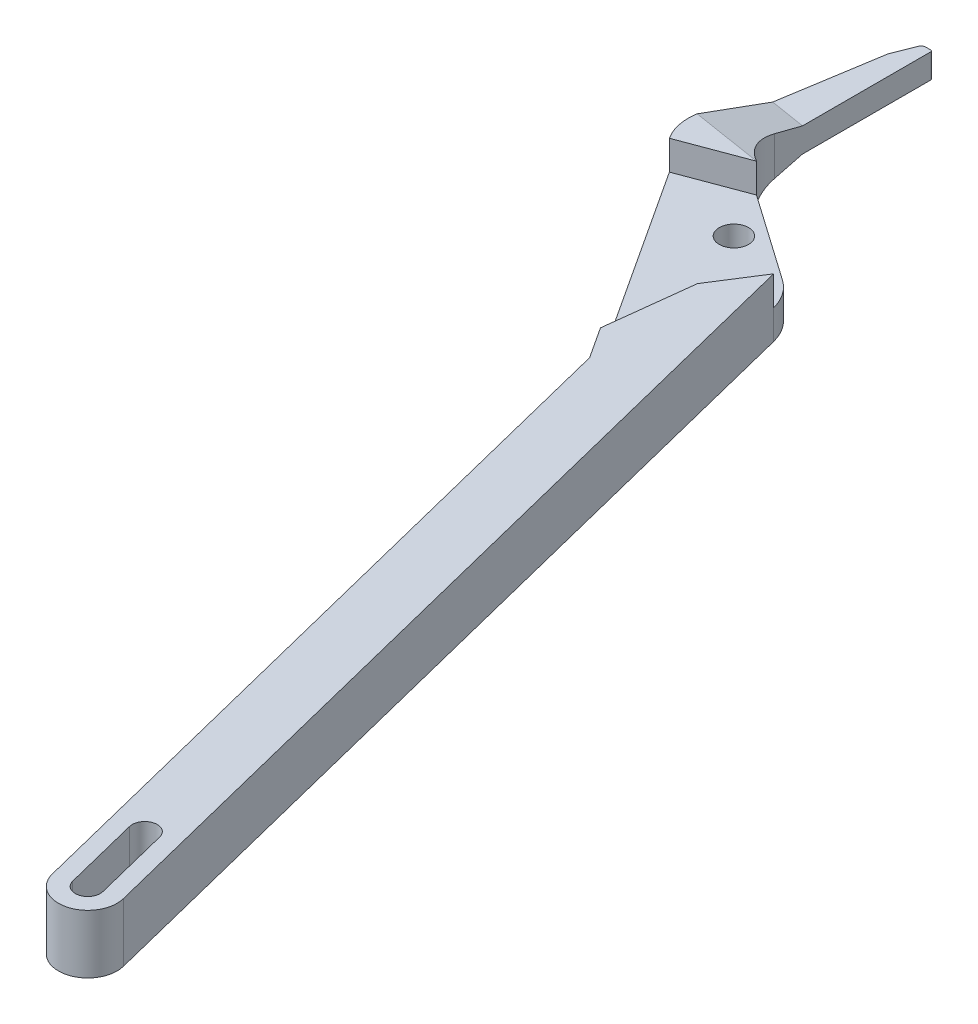
ISO-10303-21;
HEADER;
FILE_DESCRIPTION(('STEP AP214'),'2;1');
FILE_NAME('part.step','',(''),(''),'','','');
FILE_SCHEMA(('AUTOMOTIVE_DESIGN { 1 0 10303 214 1 1 1 1 }'));
ENDSEC;
DATA;
#1=APPLICATION_CONTEXT('core data for automotive mechanical design processes');
#2=APPLICATION_PROTOCOL_DEFINITION('international standard','automotive_design',2000,#1);
#3=PRODUCT_CONTEXT('',#1,'mechanical');
#4=PRODUCT('Part','Part','',(#3));
#5=PRODUCT_RELATED_PRODUCT_CATEGORY('part','',(#4));
#6=PRODUCT_DEFINITION_FORMATION('','',#4);
#7=PRODUCT_DEFINITION_CONTEXT('part definition',#1,'design');
#8=PRODUCT_DEFINITION('design','',#6,#7);
#9=PRODUCT_DEFINITION_SHAPE('','',#8);
#10=(LENGTH_UNIT() NAMED_UNIT(*) SI_UNIT(.MILLI.,.METRE.));
#11=(NAMED_UNIT(*) PLANE_ANGLE_UNIT() SI_UNIT($,.RADIAN.));
#12=(NAMED_UNIT(*) SI_UNIT($,.STERADIAN.) SOLID_ANGLE_UNIT());
#13=UNCERTAINTY_MEASURE_WITH_UNIT(LENGTH_MEASURE(1.E-05),#10,'distance_accuracy_value','');
#14=(GEOMETRIC_REPRESENTATION_CONTEXT(3) GLOBAL_UNCERTAINTY_ASSIGNED_CONTEXT((#13)) GLOBAL_UNIT_ASSIGNED_CONTEXT((#10,
#11,#12)) REPRESENTATION_CONTEXT('',''));
#15=CARTESIAN_POINT('',(0.,0.,0.));
#16=DIRECTION('',(0.,0.,1.));
#17=DIRECTION('',(1.,0.,0.));
#18=AXIS2_PLACEMENT_3D('',#15,#16,#17);
#19=CARTESIAN_POINT('',(0.,12.,0.));
#20=DIRECTION('',(0.,1.,0.));
#21=DIRECTION('',(0.,0.,1.));
#22=AXIS2_PLACEMENT_3D('',#19,#20,#21);
#23=PLANE('',#22);
#24=CARTESIAN_POINT('',(55.1439401965051,12.,187.354629282802));
#25=DIRECTION('',(0.,1.,0.));
#26=DIRECTION('',(0.,0.,1.));
#27=AXIS2_PLACEMENT_3D('',#24,#25,#26);
#28=CIRCLE('',#27,2.54999999999998);
#29=CARTESIAN_POINT('',(52.669686094504,12.,187.971530116592));
#30=VERTEX_POINT('',#29);
#31=CARTESIAN_POINT('',(57.6181942985063,12.,186.737728449012));
#32=VERTEX_POINT('',#31);
#33=EDGE_CURVE('E372',#30,#32,#28,.T.);
#34=ORIENTED_EDGE('',*,*,#33,.F.);
#35=DIRECTION('',(-0.241921895603772,0.,-0.970295726274974));
#36=VECTOR('',#35,1.);
#37=CARTESIAN_POINT('',(5.46348532178834,12.,-1.36219988386906));
#38=LINE('',#37,#36);
#39=CARTESIAN_POINT('',(48.7989357649167,12.,172.446798496485));
#40=VERTEX_POINT('',#39);
#41=EDGE_CURVE('E376',#30,#40,#38,.T.);
#42=ORIENTED_EDGE('',*,*,#41,.T.);
#43=CARTESIAN_POINT('',(51.2731898669178,12.,171.829897662696));
#44=DIRECTION('',(0.,1.,0.));
#45=DIRECTION('',(0.,0.,1.));
#46=AXIS2_PLACEMENT_3D('',#43,#44,#45);
#47=CIRCLE('',#46,2.54999999999997);
#48=CARTESIAN_POINT('',(53.747443968919,12.,171.212996828906));
#49=VERTEX_POINT('',#48);
#50=EDGE_CURVE('E379',#49,#40,#47,.T.);
#51=ORIENTED_EDGE('',*,*,#50,.F.);
#52=DIRECTION('',(-0.241921895603773,0.,-0.970295726274974));
#53=VECTOR('',#52,1.);
#54=CARTESIAN_POINT('',(10.4119935257905,12.,-2.59600155144826));
#55=LINE('',#54,#53);
#56=EDGE_CURVE('E383',#32,#49,#55,.T.);
#57=ORIENTED_EDGE('',*,*,#56,.F.);
#58=EDGE_LOOP('',(#34,#42,#51,#57));
#59=FACE_BOUND('',#58,.T.);
#60=DIRECTION('',(0.241921895603773,0.,0.970295726274974));
#61=VECTOR('',#60,1.);
#62=CARTESIAN_POINT('',(13.759513781435,12.,-3.43063209128024));
#63=LINE('',#62,#61);
#64=CARTESIAN_POINT('',(16.7667624796419,12.,8.63078364967044));
#65=VERTEX_POINT('',#64);
#66=CARTESIAN_POINT('',(60.9657145541507,12.,185.903097909181));
#67=VERTEX_POINT('',#66);
#68=EDGE_CURVE('E359',#65,#67,#63,.T.);
#69=ORIENTED_EDGE('',*,*,#68,.F.);
#70=DIRECTION('',(-0.536479988899588,0.,0.84391304143869));
#71=VECTOR('',#70,1.);
#72=CARTESIAN_POINT('',(15.848629731164,12.,10.0750578374209));
#73=LINE('',#72,#71);
#74=CARTESIAN_POINT('',(10.7122054412359,12.,18.1549406556487));
#75=VERTEX_POINT('',#74);
#76=EDGE_CURVE('E569',#65,#75,#73,.T.);
#77=ORIENTED_EDGE('',*,*,#76,.T.);
#78=DIRECTION('',(0.116867877169824,0.,-0.993147471066518));
#79=VECTOR('',#78,1.);
#80=CARTESIAN_POINT('',(12.67308722309,12.,1.49129594959353));
#81=LINE('',#80,#79);
#82=CARTESIAN_POINT('',(8.62075702087554,12.,35.9281454048767));
#83=VERTEX_POINT('',#82);
#84=EDGE_CURVE('E577',#83,#75,#81,.T.);
#85=ORIENTED_EDGE('',*,*,#84,.F.);
#86=DIRECTION('',(0.546821382181398,0.,0.837249291423544));
#87=VECTOR('',#86,1.);
#88=CARTESIAN_POINT('',(-10.405799220694,12.,6.79619985451084));
#89=LINE('',#88,#87);
#90=CARTESIAN_POINT('',(12.8013367550747,12.,42.3291156928981));
#91=VERTEX_POINT('',#90);
#92=EDGE_CURVE('E256',#83,#91,#89,.T.);
#93=ORIENTED_EDGE('',*,*,#92,.T.);
#94=DIRECTION('',(-0.241921895603773,0.,-0.970295726274974));
#95=VECTOR('',#94,1.);
#96=CARTESIAN_POINT('',(2.11596506614388,12.,-0.527569344037099));
#97=LINE('',#96,#95);
#98=CARTESIAN_POINT('',(49.3221658388595,12.,188.806160656424));
#99=VERTEX_POINT('',#98);
#100=EDGE_CURVE('E351',#99,#91,#97,.T.);
#101=ORIENTED_EDGE('',*,*,#100,.F.);
#102=CARTESIAN_POINT('',(55.1439401965051,12.,187.354629282802));
#103=DIRECTION('',(0.,1.,0.));
#104=DIRECTION('',(0.,0.,1.));
#105=AXIS2_PLACEMENT_3D('',#102,#103,#104);
#106=CIRCLE('',#105,5.99999999923498);
#107=EDGE_CURVE('E355',#99,#67,#106,.T.);
#108=ORIENTED_EDGE('',*,*,#107,.T.);
#109=EDGE_LOOP('',(#69,#77,#85,#93,#101,#108));
#110=FACE_BOUND('',#109,.T.);
#111=ADVANCED_FACE('F56',(#59,#110),#23,.T.);
#112=CARTESIAN_POINT('',(7.06380521689738,12.,11.0500026057069));
#113=DIRECTION('',(0.,-1.,0.));
#114=DIRECTION('',(0.,0.,-1.));
#115=AXIS2_PLACEMENT_3D('',#112,#113,#114);
#116=CYLINDRICAL_SURFACE('',#115,9.99999999999465);
#117=DIRECTION('',(0.,-1.,0.));
#118=VECTOR('',#117,1.);
#119=CARTESIAN_POINT('',(12.7995695803869,12.,2.85848216280857));
#120=LINE('',#119,#118);
#121=CARTESIAN_POINT('',(12.7995695803868,6.,2.85848216280873));
#122=VERTEX_POINT('',#121);
#123=CARTESIAN_POINT('',(12.7995695803869,0.,2.85848216280857));
#124=VERTEX_POINT('',#123);
#125=EDGE_CURVE('E492',#122,#124,#120,.T.);
#126=ORIENTED_EDGE('',*,*,#125,.F.);
#127=CARTESIAN_POINT('',(7.06380521689738,6.,11.0500026057069));
#128=DIRECTION('',(0.,1.,0.));
#129=DIRECTION('',(0.,0.,1.));
#130=AXIS2_PLACEMENT_3D('',#127,#128,#129);
#131=CIRCLE('',#130,9.99999999999465);
#132=CARTESIAN_POINT('',(16.7667624796419,6.,8.63078364967044));
#133=VERTEX_POINT('',#132);
#134=EDGE_CURVE('E524',#133,#122,#131,.T.);
#135=ORIENTED_EDGE('',*,*,#134,.F.);
#136=DIRECTION('',(0.,-1.,0.));
#137=VECTOR('',#136,1.);
#138=CARTESIAN_POINT('',(16.7667624796417,12.,8.63078364967049));
#139=LINE('',#138,#137);
#140=CARTESIAN_POINT('',(16.7667624796417,0.,8.63078364967049));
#141=VERTEX_POINT('',#140);
#142=EDGE_CURVE('E495',#133,#141,#139,.T.);
#143=ORIENTED_EDGE('',*,*,#142,.T.);
#144=CARTESIAN_POINT('',(7.06380521689738,0.,11.0500026057069));
#145=DIRECTION('',(0.,1.,0.));
#146=DIRECTION('',(0.,0.,1.));
#147=AXIS2_PLACEMENT_3D('',#144,#145,#146);
#148=CIRCLE('',#147,9.99999999999465);
#149=EDGE_CURVE('E399',#124,#141,#148,.F.);
#150=ORIENTED_EDGE('',*,*,#149,.F.);
#151=EDGE_LOOP('',(#126,#135,#143,#150));
#152=FACE_BOUND('',#151,.T.);
#153=ADVANCED_FACE('F523',(#152),#116,.T.);
#154=CARTESIAN_POINT('',(0.,12.,0.));
#155=DIRECTION('',(0.,-1.,0.));
#156=DIRECTION('',(0.,0.,-1.));
#157=AXIS2_PLACEMENT_3D('',#154,#155,#156);
#158=CYLINDRICAL_SURFACE('',#157,3.);
#159=CARTESIAN_POINT('',(0.,0.,0.));
#160=DIRECTION('',(0.,1.,0.));
#161=DIRECTION('',(0.,0.,1.));
#162=AXIS2_PLACEMENT_3D('',#159,#160,#161);
#163=CIRCLE('',#162,3.);
#164=CARTESIAN_POINT('',(0.,0.,3.));
#165=VERTEX_POINT('',#164);
#166=EDGE_CURVE('E356',#165,#165,#163,.T.);
#167=ORIENTED_EDGE('',*,*,#166,.F.);
#168=EDGE_LOOP('',(#167));
#169=FACE_BOUND('',#168,.T.);
#170=CARTESIAN_POINT('',(0.,6.,0.));
#171=DIRECTION('',(0.,1.,0.));
#172=DIRECTION('',(0.,0.,1.));
#173=AXIS2_PLACEMENT_3D('',#170,#171,#172);
#174=CIRCLE('',#173,3.);
#175=CARTESIAN_POINT('',(0.,6.,3.));
#176=VERTEX_POINT('',#175);
#177=EDGE_CURVE('E251',#176,#176,#174,.F.);
#178=ORIENTED_EDGE('',*,*,#177,.F.);
#179=EDGE_LOOP('',(#178));
#180=FACE_BOUND('',#179,.T.);
#181=ADVANCED_FACE('F601',(#169,#180),#158,.F.);
#182=CARTESIAN_POINT('',(2.86788218145437,12.,-4.09576022103421));
#183=DIRECTION('',(0.573576436349266,0.,-0.819152044290238));
#184=DIRECTION('',(-0.819152044290239,0.,-0.573576436349266));
#185=AXIS2_PLACEMENT_3D('',#182,#183,#184);
#186=PLANE('',#185);
#187=DIRECTION('',(0.,1.,0.));
#188=VECTOR('',#187,1.);
#189=CARTESIAN_POINT('',(-4.95077941001486,6.,-9.57044600606636));
#190=LINE('',#189,#188);
#191=CARTESIAN_POINT('',(-4.95077941001486,6.,-9.57044600606636));
#192=VERTEX_POINT('',#191);
#193=CARTESIAN_POINT('',(-4.95077941001486,12.,-9.57044600606636));
#194=VERTEX_POINT('',#193);
#195=EDGE_CURVE('E262',#192,#194,#190,.T.);
#196=ORIENTED_EDGE('',*,*,#195,.F.);
#197=DIRECTION('',(-0.819152044290239,0.,-0.573576436349266));
#198=VECTOR('',#197,1.);
#199=CARTESIAN_POINT('',(2.86788218145437,6.,-4.09576022103421));
#200=LINE('',#199,#198);
#201=EDGE_CURVE('E264',#122,#192,#200,.T.);
#202=ORIENTED_EDGE('',*,*,#201,.F.);
#203=ORIENTED_EDGE('',*,*,#125,.T.);
#204=DIRECTION('',(0.819152044290239,0.,0.573576436349266));
#205=VECTOR('',#204,1.);
#206=CARTESIAN_POINT('',(2.86788218145437,0.,-4.09576022103421));
#207=LINE('',#206,#205);
#208=CARTESIAN_POINT('',(-4.95077941001487,0.,-9.57044600606637));
#209=VERTEX_POINT('',#208);
#210=EDGE_CURVE('E403',#209,#124,#207,.T.);
#211=ORIENTED_EDGE('',*,*,#210,.F.);
#212=DIRECTION('',(0.81395029880329,-0.112516633880118,0.569934134947473));
#213=VECTOR('',#212,1.);
#214=CARTESIAN_POINT('',(1.66990260801636,-0.915211722085175,-4.93459454897287));
#215=LINE('',#214,#213);
#216=CARTESIAN_POINT('',(-5.73576436348951,0.10851260174161,-10.120098387868));
#217=VERTEX_POINT('',#216);
#218=EDGE_CURVE('E293',#217,#209,#215,.T.);
#219=ORIENTED_EDGE('',*,*,#218,.F.);
#220=DIRECTION('',(0.,-1.,0.));
#221=VECTOR('',#220,1.);
#222=CARTESIAN_POINT('',(-5.73576436348951,12.,-10.120098387868));
#223=LINE('',#222,#221);
#224=CARTESIAN_POINT('',(-5.73576436348951,11.8914873982584,-10.120098387868));
#225=VERTEX_POINT('',#224);
#226=EDGE_CURVE('E488',#225,#217,#223,.T.);
#227=ORIENTED_EDGE('',*,*,#226,.F.);
#228=DIRECTION('',(0.81395029880329,0.112516633880118,0.569934134947473));
#229=VECTOR('',#228,1.);
#230=CARTESIAN_POINT('',(2.76889798122112,13.0671316368817,-4.16506970420087));
#231=LINE('',#230,#229);
#232=EDGE_CURVE('E304',#225,#194,#231,.T.);
#233=ORIENTED_EDGE('',*,*,#232,.T.);
#234=EDGE_LOOP('',(#196,#202,#203,#211,#219,#227,#233));
#235=FACE_BOUND('',#234,.T.);
#236=ADVANCED_FACE('F517',(#235),#186,.T.);
#237=CARTESIAN_POINT('',(0.,12.,-18.3116188307658));
#238=DIRECTION('',(0.,-1.,0.));
#239=DIRECTION('',(0.,0.,-1.));
#240=AXIS2_PLACEMENT_3D('',#237,#238,#239);
#241=CYLINDRICAL_SURFACE('',#240,9.99999999999447);
#242=DIRECTION('',(0.,-1.,0.));
#243=VECTOR('',#242,1.);
#244=CARTESIAN_POINT('',(-9.99999999999447,12.,-18.3116188307658));
#245=LINE('',#244,#243);
#246=CARTESIAN_POINT('',(-9.99999999999447,9.96879032351413,-18.3116188307658));
#247=VERTEX_POINT('',#246);
#248=CARTESIAN_POINT('',(-9.99999999999447,2.03120967648587,-18.3116188307658));
#249=VERTEX_POINT('',#248);
#250=EDGE_CURVE('E484',#247,#249,#245,.T.);
#251=ORIENTED_EDGE('',*,*,#250,.F.);
#252=CARTESIAN_POINT('',(0.,9.55783461699226,-18.3116188307658));
#253=DIRECTION('',(0.0397791490718457,0.967966825634217,-0.247906925620759));
#254=DIRECTION('',(0.153358229714901,-0.251078124239482,-0.955741088845246));
#255=AXIS2_PLACEMENT_3D('',#252,#253,#254);
#256=ELLIPSE('',#255,10.3309325641841,9.99999999999447);
#257=EDGE_CURVE('E300',#247,#225,#256,.T.);
#258=ORIENTED_EDGE('',*,*,#257,.T.);
#259=ORIENTED_EDGE('',*,*,#226,.T.);
#260=CARTESIAN_POINT('',(0.,2.44216538300773,-18.3116188307658));
#261=DIRECTION('',(-0.0397791490718457,0.967966825634218,0.247906925620759));
#262=DIRECTION('',(-0.153358229714901,-0.251078124239482,0.955741088845246));
#263=AXIS2_PLACEMENT_3D('',#260,#261,#262);
#264=ELLIPSE('',#263,10.3309325641841,9.99999999999447);
#265=EDGE_CURVE('E290',#249,#217,#264,.T.);
#266=ORIENTED_EDGE('',*,*,#265,.F.);
#267=EDGE_LOOP('',(#251,#258,#259,#266));
#268=FACE_BOUND('',#267,.T.);
#269=ADVANCED_FACE('F561',(#268),#241,.F.);
#270=CARTESIAN_POINT('',(-9.99999999999447,12.,0.));
#271=DIRECTION('',(1.,0.,0.));
#272=DIRECTION('',(0.,0.,-1.));
#273=AXIS2_PLACEMENT_3D('',#270,#271,#272);
#274=PLANE('',#273);
#275=DIRECTION('',(0.,-1.,0.));
#276=VECTOR('',#275,1.);
#277=CARTESIAN_POINT('',(-9.99999999999449,12.,-50.3559483259001));
#278=LINE('',#277,#276);
#279=CARTESIAN_POINT('',(-9.99999999999449,8.5,-50.3559483259001));
#280=VERTEX_POINT('',#279);
#281=CARTESIAN_POINT('',(-9.99999999999449,3.49999999999999,-50.3559483259001));
#282=VERTEX_POINT('',#281);
#283=EDGE_CURVE('E480',#280,#282,#278,.T.);
#284=ORIENTED_EDGE('',*,*,#283,.F.);
#285=DIRECTION('',(0.,0.,1.));
#286=VECTOR('',#285,1.);
#287=CARTESIAN_POINT('',(-9.99999999999447,8.5,0.));
#288=LINE('',#287,#286);
#289=CARTESIAN_POINT('',(-9.99999999999449,8.5,-24.046594985281));
#290=VERTEX_POINT('',#289);
#291=EDGE_CURVE('E346',#280,#290,#288,.T.);
#292=ORIENTED_EDGE('',*,*,#291,.T.);
#293=DIRECTION('',(0.,0.248103300273469,0.968733581741344));
#294=VECTOR('',#293,1.);
#295=CARTESIAN_POINT('',(-9.99999999999447,14.4949462540739,-0.638983112909107));
#296=LINE('',#295,#294);
#297=EDGE_CURVE('E296',#290,#247,#296,.T.);
#298=ORIENTED_EDGE('',*,*,#297,.T.);
#299=ORIENTED_EDGE('',*,*,#250,.T.);
#300=DIRECTION('',(0.,-0.248103300273469,0.968733581741344));
#301=VECTOR('',#300,1.);
#302=CARTESIAN_POINT('',(-9.99999999999447,-1.7562832827949,-3.52313509749829));
#303=LINE('',#302,#301);
#304=CARTESIAN_POINT('',(-9.99999999999449,3.49999999999999,-24.046594985281));
#305=VERTEX_POINT('',#304);
#306=EDGE_CURVE('E278',#305,#249,#303,.T.);
#307=ORIENTED_EDGE('',*,*,#306,.F.);
#308=DIRECTION('',(0.,0.,1.));
#309=VECTOR('',#308,1.);
#310=CARTESIAN_POINT('',(-9.99999999999447,3.5,0.));
#311=LINE('',#310,#309);
#312=EDGE_CURVE('E326',#282,#305,#311,.T.);
#313=ORIENTED_EDGE('',*,*,#312,.F.);
#314=EDGE_LOOP('',(#284,#292,#298,#299,#307,#313));
#315=FACE_BOUND('',#314,.T.);
#316=ADVANCED_FACE('F558',(#315),#274,.T.);
#317=CARTESIAN_POINT('',(-10.2499999999945,12.,-50.3559483259001));
#318=DIRECTION('',(0.,-1.,0.));
#319=DIRECTION('',(0.,0.,-1.));
#320=AXIS2_PLACEMENT_3D('',#317,#318,#319);
#321=CYLINDRICAL_SURFACE('',#320,0.25);
#322=CARTESIAN_POINT('',(-10.2499999999945,8.5,-50.3559483259001));
#323=DIRECTION('',(0.,1.,0.));
#324=DIRECTION('',(0.,0.,1.));
#325=AXIS2_PLACEMENT_3D('',#322,#323,#324);
#326=CIRCLE('',#325,0.25);
#327=CARTESIAN_POINT('',(-10.2499999999945,8.5,-50.6059483259001));
#328=VERTEX_POINT('',#327);
#329=EDGE_CURVE('E343',#280,#328,#326,.T.);
#330=ORIENTED_EDGE('',*,*,#329,.F.);
#331=ORIENTED_EDGE('',*,*,#283,.T.);
#332=CARTESIAN_POINT('',(-10.2499999999945,3.49999999999999,-50.3559483259001));
#333=DIRECTION('',(0.,1.,0.));
#334=DIRECTION('',(0.,0.,1.));
#335=AXIS2_PLACEMENT_3D('',#332,#333,#334);
#336=CIRCLE('',#335,0.25);
#337=CARTESIAN_POINT('',(-10.2499999999945,3.49999999999999,-50.6059483259001));
#338=VERTEX_POINT('',#337);
#339=EDGE_CURVE('E322',#282,#338,#336,.T.);
#340=ORIENTED_EDGE('',*,*,#339,.T.);
#341=DIRECTION('',(0.,-1.,0.));
#342=VECTOR('',#341,1.);
#343=CARTESIAN_POINT('',(-10.2499999999945,12.,-50.6059483259001));
#344=LINE('',#343,#342);
#345=EDGE_CURVE('E476',#328,#338,#344,.T.);
#346=ORIENTED_EDGE('',*,*,#345,.F.);
#347=EDGE_LOOP('',(#330,#331,#340,#346));
#348=FACE_BOUND('',#347,.T.);
#349=ADVANCED_FACE('F637',(#348),#321,.T.);
#350=CARTESIAN_POINT('',(0.,12.,-50.6059483259001));
#351=DIRECTION('',(0.,0.,1.));
#352=DIRECTION('',(1.,0.,0.));
#353=AXIS2_PLACEMENT_3D('',#350,#351,#352);
#354=PLANE('',#353);
#355=DIRECTION('',(-1.,0.,0.));
#356=VECTOR('',#355,1.);
#357=CARTESIAN_POINT('',(0.,8.5,-50.6059483259001));
#358=LINE('',#357,#356);
#359=CARTESIAN_POINT('',(-11.3229670385738,8.5,-50.6059483259001));
#360=VERTEX_POINT('',#359);
#361=EDGE_CURVE('E340',#328,#360,#358,.T.);
#362=ORIENTED_EDGE('',*,*,#361,.F.);
#363=ORIENTED_EDGE('',*,*,#345,.T.);
#364=DIRECTION('',(-1.,0.,0.));
#365=VECTOR('',#364,1.);
#366=CARTESIAN_POINT('',(0.,3.49999999999999,-50.6059483259001));
#367=LINE('',#366,#365);
#368=CARTESIAN_POINT('',(-11.3229670385738,3.49999999999999,-50.6059483259001));
#369=VERTEX_POINT('',#368);
#370=EDGE_CURVE('E318',#338,#369,#367,.T.);
#371=ORIENTED_EDGE('',*,*,#370,.T.);
#372=DIRECTION('',(0.,-1.,0.));
#373=VECTOR('',#372,1.);
#374=CARTESIAN_POINT('',(-11.3229670385738,12.,-50.6059483259001));
#375=LINE('',#374,#373);
#376=EDGE_CURVE('E472',#360,#369,#375,.T.);
#377=ORIENTED_EDGE('',*,*,#376,.F.);
#378=EDGE_LOOP('',(#362,#363,#371,#377));
#379=FACE_BOUND('',#378,.T.);
#380=ADVANCED_FACE('F633',(#379),#354,.F.);
#381=CARTESIAN_POINT('',(-11.3229670385738,12.,-49.6059483259001));
#382=DIRECTION('',(0.,-1.,0.));
#383=DIRECTION('',(0.,0.,-1.));
#384=AXIS2_PLACEMENT_3D('',#381,#382,#383);
#385=CYLINDRICAL_SURFACE('',#384,1.00000000000001);
#386=DIRECTION('',(0.,-1.,0.));
#387=VECTOR('',#386,1.);
#388=CARTESIAN_POINT('',(-12.2514437294591,12.,-49.9773390022542));
#389=LINE('',#388,#387);
#390=CARTESIAN_POINT('',(-12.2514437294591,8.5,-49.9773390022542));
#391=VERTEX_POINT('',#390);
#392=CARTESIAN_POINT('',(-12.2514437294591,3.49999999999999,-49.9773390022542));
#393=VERTEX_POINT('',#392);
#394=EDGE_CURVE('E468',#391,#393,#389,.T.);
#395=ORIENTED_EDGE('',*,*,#394,.F.);
#396=CARTESIAN_POINT('',(-11.3229670385738,8.5,-49.6059483259001));
#397=DIRECTION('',(0.,1.,0.));
#398=DIRECTION('',(0.,0.,1.));
#399=AXIS2_PLACEMENT_3D('',#396,#397,#398);
#400=CIRCLE('',#399,1.00000000000001);
#401=EDGE_CURVE('E336',#391,#360,#400,.F.);
#402=ORIENTED_EDGE('',*,*,#401,.T.);
#403=ORIENTED_EDGE('',*,*,#376,.T.);
#404=CARTESIAN_POINT('',(-11.3229670385738,3.49999999999999,-49.6059483259001));
#405=DIRECTION('',(0.,1.,0.));
#406=DIRECTION('',(0.,0.,1.));
#407=AXIS2_PLACEMENT_3D('',#404,#405,#406);
#408=CIRCLE('',#407,1.00000000000001);
#409=EDGE_CURVE('E315',#393,#369,#408,.F.);
#410=ORIENTED_EDGE('',*,*,#409,.F.);
#411=EDGE_LOOP('',(#395,#402,#403,#410));
#412=FACE_BOUND('',#411,.T.);
#413=ADVANCED_FACE('F629',(#412),#385,.T.);
#414=CARTESIAN_POINT('',(-27.7951545951386,12.,-11.1180618380553));
#415=DIRECTION('',(0.928476690885261,0.,0.371390676354102));
#416=DIRECTION('',(0.371390676354102,0.,-0.928476690885261));
#417=AXIS2_PLACEMENT_3D('',#414,#415,#416);
#418=PLANE('',#417);
#419=DIRECTION('',(-0.371390676354102,0.,0.928476690885261));
#420=VECTOR('',#419,1.);
#421=CARTESIAN_POINT('',(-27.7951545951386,8.5,-11.1180618380553));
#422=LINE('',#421,#420);
#423=CARTESIAN_POINT('',(-13.8761533818609,8.5,-45.9155648712497));
#424=VERTEX_POINT('',#423);
#425=EDGE_CURVE('E333',#391,#424,#422,.T.);
#426=ORIENTED_EDGE('',*,*,#425,.F.);
#427=ORIENTED_EDGE('',*,*,#394,.T.);
#428=DIRECTION('',(-0.371390676354102,0.,0.928476690885261));
#429=VECTOR('',#428,1.);
#430=CARTESIAN_POINT('',(-27.7951545951386,3.49999999999999,-11.1180618380553));
#431=LINE('',#430,#429);
#432=CARTESIAN_POINT('',(-13.8761533818609,3.49999999999999,-45.9155648712497));
#433=VERTEX_POINT('',#432);
#434=EDGE_CURVE('E311',#393,#433,#431,.T.);
#435=ORIENTED_EDGE('',*,*,#434,.T.);
#436=DIRECTION('',(0.,-1.,0.));
#437=VECTOR('',#436,1.);
#438=CARTESIAN_POINT('',(-13.8761533818609,12.,-45.9155648712497));
#439=LINE('',#438,#437);
#440=EDGE_CURVE('E464',#424,#433,#439,.T.);
#441=ORIENTED_EDGE('',*,*,#440,.F.);
#442=EDGE_LOOP('',(#426,#427,#435,#441));
#443=FACE_BOUND('',#442,.T.);
#444=ADVANCED_FACE('F621',(#443),#418,.F.);
#445=CARTESIAN_POINT('',(-11.0907233092051,12.,-44.8013928421874));
#446=DIRECTION('',(0.,-1.,0.));
#447=DIRECTION('',(0.,0.,-1.));
#448=AXIS2_PLACEMENT_3D('',#445,#446,#447);
#449=CYLINDRICAL_SURFACE('',#448,3.);
#450=DIRECTION('',(0.,-1.,0.));
#451=VECTOR('',#450,1.);
#452=CARTESIAN_POINT('',(-14.0528323305108,12.,-45.2766929009918));
#453=LINE('',#452,#451);
#454=CARTESIAN_POINT('',(-14.0528323305108,8.5,-45.2766929009918));
#455=VERTEX_POINT('',#454);
#456=CARTESIAN_POINT('',(-14.0528323305108,3.49999999999999,-45.2766929009918));
#457=VERTEX_POINT('',#456);
#458=EDGE_CURVE('E460',#455,#457,#453,.T.);
#459=ORIENTED_EDGE('',*,*,#458,.F.);
#460=CARTESIAN_POINT('',(-11.0907233092051,8.5,-44.8013928421874));
#461=DIRECTION('',(0.,1.,0.));
#462=DIRECTION('',(0.,0.,1.));
#463=AXIS2_PLACEMENT_3D('',#460,#461,#462);
#464=CIRCLE('',#463,3.);
#465=EDGE_CURVE('E329',#455,#424,#464,.F.);
#466=ORIENTED_EDGE('',*,*,#465,.T.);
#467=ORIENTED_EDGE('',*,*,#440,.T.);
#468=CARTESIAN_POINT('',(-11.0907233092051,3.49999999999999,-44.8013928421874));
#469=DIRECTION('',(0.,1.,0.));
#470=DIRECTION('',(0.,0.,1.));
#471=AXIS2_PLACEMENT_3D('',#468,#469,#470);
#472=CIRCLE('',#471,3.);
#473=EDGE_CURVE('E308',#457,#433,#472,.F.);
#474=ORIENTED_EDGE('',*,*,#473,.F.);
#475=EDGE_LOOP('',(#459,#466,#467,#474));
#476=FACE_BOUND('',#475,.T.);
#477=ADVANCED_FACE('F616',(#476),#449,.T.);
#478=CARTESIAN_POINT('',(-20.7828270605803,12.,-3.33481274759509));
#479=DIRECTION('',(0.98736967376856,0.,0.158433352934817));
#480=DIRECTION('',(0.158433352934817,0.,-0.987369673768561));
#481=AXIS2_PLACEMENT_3D('',#478,#479,#480);
#482=PLANE('',#481);
#483=DIRECTION('',(0.158433352934817,0.,-0.98736967376856));
#484=VECTOR('',#483,1.);
#485=CARTESIAN_POINT('',(-20.7828270605804,8.5,-3.33481274759509));
#486=LINE('',#485,#484);
#487=CARTESIAN_POINT('',(-17.2721744616136,8.5,-25.2134882104737));
#488=VERTEX_POINT('',#487);
#489=EDGE_CURVE('E268',#488,#455,#486,.T.);
#490=ORIENTED_EDGE('',*,*,#489,.T.);
#491=ORIENTED_EDGE('',*,*,#458,.T.);
#492=DIRECTION('',(0.158433352934817,0.,-0.98736967376856));
#493=VECTOR('',#492,1.);
#494=CARTESIAN_POINT('',(-20.7828270605804,3.5,-3.33481274759509));
#495=LINE('',#494,#493);
#496=CARTESIAN_POINT('',(-17.2721744616136,3.49999999999999,-25.2134882104737));
#497=VERTEX_POINT('',#496);
#498=EDGE_CURVE('E283',#497,#457,#495,.T.);
#499=ORIENTED_EDGE('',*,*,#498,.F.);
#500=DIRECTION('',(0.153358229714901,0.251078124239482,-0.955741088845246));
#501=VECTOR('',#500,1.);
#502=CARTESIAN_POINT('',(-20.6962818709869,-2.10594933273692,-3.87416948045608));
#503=LINE('',#502,#501);
#504=CARTESIAN_POINT('',(-19.4099704389731,0.,-11.8905680194349));
#505=VERTEX_POINT('',#504);
#506=EDGE_CURVE('E279',#505,#497,#503,.T.);
#507=ORIENTED_EDGE('',*,*,#506,.F.);
#508=DIRECTION('',(-0.158433352934817,0.,0.987369673768561));
#509=VECTOR('',#508,1.);
#510=CARTESIAN_POINT('',(-20.7828270605803,0.,-3.33481274759509));
#511=LINE('',#510,#509);
#512=CARTESIAN_POINT('',(-19.4457443057617,0.,-11.667622342113));
#513=VERTEX_POINT('',#512);
#514=EDGE_CURVE('E407',#505,#513,#511,.T.);
#515=ORIENTED_EDGE('',*,*,#514,.T.);
#516=DIRECTION('',(0.,-1.,0.));
#517=VECTOR('',#516,1.);
#518=CARTESIAN_POINT('',(-19.4457443057617,12.,-11.667622342113));
#519=LINE('',#518,#517);
#520=CARTESIAN_POINT('',(-19.4457443057617,12.,-11.667622342113));
#521=VERTEX_POINT('',#520);
#522=EDGE_CURVE('E456',#521,#513,#519,.T.);
#523=ORIENTED_EDGE('',*,*,#522,.F.);
#524=DIRECTION('',(-0.158433352934817,0.,0.987369673768561));
#525=VECTOR('',#524,1.);
#526=CARTESIAN_POINT('',(-20.7828270605803,12.,-3.33481274759509));
#527=LINE('',#526,#525);
#528=CARTESIAN_POINT('',(-19.4099704389731,12.,-11.8905680194348));
#529=VERTEX_POINT('',#528);
#530=EDGE_CURVE('E363',#529,#521,#527,.T.);
#531=ORIENTED_EDGE('',*,*,#530,.F.);
#532=DIRECTION('',(0.153358229714901,-0.251078124239482,-0.955741088845246));
#533=VECTOR('',#532,1.);
#534=CARTESIAN_POINT('',(-20.2342231111449,13.3494666390775,-6.75375763860645));
#535=LINE('',#534,#533);
#536=EDGE_CURVE('E80',#529,#488,#535,.T.);
#537=ORIENTED_EDGE('',*,*,#536,.T.);
#538=EDGE_LOOP('',(#490,#491,#499,#507,#515,#523,#531,#537));
#539=FACE_BOUND('',#538,.T.);
#540=ADVANCED_FACE('F548',(#539),#482,.F.);
#541=DIRECTION('',(-0.936740405897096,0.,0.350024873344375));
#542=VECTOR('',#541,1.);
#543=CARTESIAN_POINT('',(-3.74453788733348,12.,-10.0211733725185));
#544=LINE('',#543,#542);
#545=CARTESIAN_POINT('',(-17.9280785863922,12.,-4.72131440891548));
#546=VERTEX_POINT('',#545);
#547=EDGE_CURVE('E566',#194,#546,#544,.T.);
#548=ORIENTED_EDGE('',*,*,#547,.F.);
#549=DIRECTION('',(-0.98736967376856,0.,-0.158433352934817));
#550=VECTOR('',#549,1.);
#551=CARTESIAN_POINT('',(1.3728566216072,12.,-8.55575527183976));
#552=LINE('',#551,#550);
#553=EDGE_CURVE('E13',#194,#529,#552,.T.);
#554=ORIENTED_EDGE('',*,*,#553,.T.);
#555=ORIENTED_EDGE('',*,*,#530,.T.);
#556=CARTESIAN_POINT('',(-9.55558567216132,12.,-10.1895282307264));
#557=DIRECTION('',(0.,1.,0.));
#558=DIRECTION('',(0.,0.,1.));
#559=AXIS2_PLACEMENT_3D('',#556,#557,#558);
#560=CIRCLE('',#559,9.9999999999946);
#561=EDGE_CURVE('E366',#546,#521,#560,.F.);
#562=ORIENTED_EDGE('',*,*,#561,.F.);
#563=EDGE_LOOP('',(#548,#554,#555,#562));
#564=FACE_BOUND('',#563,.T.);
#565=ADVANCED_FACE('F565',(#564),#23,.T.);
#566=CARTESIAN_POINT('',(55.1439401965051,12.,187.354629282802));
#567=DIRECTION('',(0.,-1.,0.));
#568=DIRECTION('',(0.,0.,-1.));
#569=AXIS2_PLACEMENT_3D('',#566,#567,#568);
#570=CYLINDRICAL_SURFACE('',#569,2.54999999999998);
#571=CARTESIAN_POINT('',(55.1439401965051,0.,187.354629282802));
#572=DIRECTION('',(0.,1.,0.));
#573=DIRECTION('',(0.,0.,1.));
#574=AXIS2_PLACEMENT_3D('',#571,#572,#573);
#575=CIRCLE('',#574,2.54999999999998);
#576=CARTESIAN_POINT('',(52.669686094504,0.,187.971530116592));
#577=VERTEX_POINT('',#576);
#578=CARTESIAN_POINT('',(57.6181942985063,0.,186.737728449012));
#579=VERTEX_POINT('',#578);
#580=EDGE_CURVE('E418',#577,#579,#575,.T.);
#581=ORIENTED_EDGE('',*,*,#580,.F.);
#582=DIRECTION('',(0.,-1.,0.));
#583=VECTOR('',#582,1.);
#584=CARTESIAN_POINT('',(52.669686094504,12.,187.971530116592));
#585=LINE('',#584,#583);
#586=EDGE_CURVE('E447',#30,#577,#585,.T.);
#587=ORIENTED_EDGE('',*,*,#586,.F.);
#588=ORIENTED_EDGE('',*,*,#33,.T.);
#589=DIRECTION('',(0.,-1.,0.));
#590=VECTOR('',#589,1.);
#591=CARTESIAN_POINT('',(57.6181942985063,12.,186.737728449012));
#592=LINE('',#591,#590);
#593=EDGE_CURVE('E437',#32,#579,#592,.T.);
#594=ORIENTED_EDGE('',*,*,#593,.T.);
#595=EDGE_LOOP('',(#581,#587,#588,#594));
#596=FACE_BOUND('',#595,.T.);
#597=ADVANCED_FACE('F608',(#596),#570,.F.);
#598=CARTESIAN_POINT('',(5.46348532178834,12.,-1.36219988386906));
#599=DIRECTION('',(-0.970295726274974,0.,0.241921895603772));
#600=DIRECTION('',(0.241921895603772,0.,0.970295726274974));
#601=AXIS2_PLACEMENT_3D('',#598,#599,#600);
#602=PLANE('',#601);
#603=DIRECTION('',(-0.241921895603772,0.,-0.970295726274974));
#604=VECTOR('',#603,1.);
#605=CARTESIAN_POINT('',(5.46348532178834,0.,-1.36219988386906));
#606=LINE('',#605,#604);
#607=CARTESIAN_POINT('',(48.7989357649167,0.,172.446798496485));
#608=VERTEX_POINT('',#607);
#609=EDGE_CURVE('E422',#577,#608,#606,.T.);
#610=ORIENTED_EDGE('',*,*,#609,.T.);
#611=DIRECTION('',(0.,-1.,0.));
#612=VECTOR('',#611,1.);
#613=CARTESIAN_POINT('',(48.7989357649167,12.,172.446798496485));
#614=LINE('',#613,#612);
#615=EDGE_CURVE('E444',#40,#608,#614,.T.);
#616=ORIENTED_EDGE('',*,*,#615,.F.);
#617=ORIENTED_EDGE('',*,*,#41,.F.);
#618=ORIENTED_EDGE('',*,*,#586,.T.);
#619=EDGE_LOOP('',(#610,#616,#617,#618));
#620=FACE_BOUND('',#619,.T.);
#621=ADVANCED_FACE('F613',(#620),#602,.F.);
#622=CARTESIAN_POINT('',(51.2731898669178,12.,171.829897662696));
#623=DIRECTION('',(0.,-1.,0.));
#624=DIRECTION('',(0.,0.,-1.));
#625=AXIS2_PLACEMENT_3D('',#622,#623,#624);
#626=CYLINDRICAL_SURFACE('',#625,2.54999999999997);
#627=CARTESIAN_POINT('',(51.2731898669178,0.,171.829897662696));
#628=DIRECTION('',(0.,1.,0.));
#629=DIRECTION('',(0.,0.,1.));
#630=AXIS2_PLACEMENT_3D('',#627,#628,#629);
#631=CIRCLE('',#630,2.54999999999997);
#632=CARTESIAN_POINT('',(53.747443968919,0.,171.212996828906));
#633=VERTEX_POINT('',#632);
#634=EDGE_CURVE('E426',#633,#608,#631,.T.);
#635=ORIENTED_EDGE('',*,*,#634,.F.);
#636=DIRECTION('',(0.,-1.,0.));
#637=VECTOR('',#636,1.);
#638=CARTESIAN_POINT('',(53.747443968919,12.,171.212996828906));
#639=LINE('',#638,#637);
#640=EDGE_CURVE('E440',#49,#633,#639,.T.);
#641=ORIENTED_EDGE('',*,*,#640,.F.);
#642=ORIENTED_EDGE('',*,*,#50,.T.);
#643=ORIENTED_EDGE('',*,*,#615,.T.);
#644=EDGE_LOOP('',(#635,#641,#642,#643));
#645=FACE_BOUND('',#644,.T.);
#646=ADVANCED_FACE('F653',(#645),#626,.F.);
#647=CARTESIAN_POINT('',(2.11596506614388,12.,-0.527569344037099));
#648=DIRECTION('',(-0.970295726274974,0.,0.241921895603772));
#649=DIRECTION('',(0.241921895603773,0.,0.970295726274974));
#650=AXIS2_PLACEMENT_3D('',#647,#648,#649);
#651=PLANE('',#650);
#652=DIRECTION('',(-0.241921895603773,0.,-0.970295726274974));
#653=VECTOR('',#652,1.);
#654=CARTESIAN_POINT('',(2.11596506614388,0.,-0.527569344037099));
#655=LINE('',#654,#653);
#656=CARTESIAN_POINT('',(49.3221658388595,0.,188.806160656424));
#657=VERTEX_POINT('',#656);
#658=CARTESIAN_POINT('',(12.8013367550747,0.,42.3291156928981));
#659=VERTEX_POINT('',#658);
#660=EDGE_CURVE('E350',#657,#659,#655,.T.);
#661=ORIENTED_EDGE('',*,*,#660,.F.);
#662=DIRECTION('',(0.,-1.,0.));
#663=VECTOR('',#662,1.);
#664=CARTESIAN_POINT('',(49.3221658388595,12.,188.806160656424));
#665=LINE('',#664,#663);
#666=EDGE_CURVE('E441',#99,#657,#665,.T.);
#667=ORIENTED_EDGE('',*,*,#666,.F.);
#668=ORIENTED_EDGE('',*,*,#100,.T.);
#669=DIRECTION('',(0.,-1.,0.));
#670=VECTOR('',#669,1.);
#671=CARTESIAN_POINT('',(12.8013367550747,12.,42.3291156928981));
#672=LINE('',#671,#670);
#673=EDGE_CURVE('E387',#91,#659,#672,.T.);
#674=ORIENTED_EDGE('',*,*,#673,.T.);
#675=EDGE_LOOP('',(#661,#667,#668,#674));
#676=FACE_BOUND('',#675,.T.);
#677=ADVANCED_FACE('F58',(#676),#651,.T.);
#678=CARTESIAN_POINT('',(55.1439401965051,12.,187.354629282802));
#679=DIRECTION('',(0.,-1.,0.));
#680=DIRECTION('',(0.,0.,-1.));
#681=AXIS2_PLACEMENT_3D('',#678,#679,#680);
#682=CYLINDRICAL_SURFACE('',#681,5.99999999923498);
#683=CARTESIAN_POINT('',(55.1439401965051,0.,187.354629282802));
#684=DIRECTION('',(0.,1.,0.));
#685=DIRECTION('',(0.,0.,1.));
#686=AXIS2_PLACEMENT_3D('',#683,#684,#685);
#687=CIRCLE('',#686,5.99999999923498);
#688=CARTESIAN_POINT('',(60.9657145541507,0.,185.903097909181));
#689=VERTEX_POINT('',#688);
#690=EDGE_CURVE('E391',#657,#689,#687,.T.);
#691=ORIENTED_EDGE('',*,*,#690,.T.);
#692=DIRECTION('',(0.,-1.,0.));
#693=VECTOR('',#692,1.);
#694=CARTESIAN_POINT('',(60.9657145541507,12.,185.903097909181));
#695=LINE('',#694,#693);
#696=EDGE_CURVE('E499',#67,#689,#695,.T.);
#697=ORIENTED_EDGE('',*,*,#696,.F.);
#698=ORIENTED_EDGE('',*,*,#107,.F.);
#699=ORIENTED_EDGE('',*,*,#666,.T.);
#700=EDGE_LOOP('',(#691,#697,#698,#699));
#701=FACE_BOUND('',#700,.T.);
#702=ADVANCED_FACE('F536',(#701),#682,.T.);
#703=CARTESIAN_POINT('',(13.759513781435,12.,-3.43063209128024));
#704=DIRECTION('',(0.970295726274974,0.,-0.241921895603773));
#705=DIRECTION('',(-0.241921895603773,0.,-0.970295726274974));
#706=AXIS2_PLACEMENT_3D('',#703,#704,#705);
#707=PLANE('',#706);
#708=DIRECTION('',(0.241921895603773,0.,0.970295726274974));
#709=VECTOR('',#708,1.);
#710=CARTESIAN_POINT('',(13.759513781435,0.,-3.43063209128024));
#711=LINE('',#710,#709);
#712=EDGE_CURVE('E395',#141,#689,#711,.T.);
#713=ORIENTED_EDGE('',*,*,#712,.F.);
#714=ORIENTED_EDGE('',*,*,#142,.F.);
#715=EDGE_CURVE('E496',#65,#133,#139,.T.);
#716=ORIENTED_EDGE('',*,*,#715,.F.);
#717=ORIENTED_EDGE('',*,*,#68,.T.);
#718=ORIENTED_EDGE('',*,*,#696,.T.);
#719=EDGE_LOOP('',(#713,#714,#716,#717,#718));
#720=FACE_BOUND('',#719,.T.);
#721=ADVANCED_FACE('F530',(#720),#707,.T.);
#722=CARTESIAN_POINT('',(-9.55558567216132,12.,-10.1895282307264));
#723=DIRECTION('',(0.,-1.,0.));
#724=DIRECTION('',(0.,0.,-1.));
#725=AXIS2_PLACEMENT_3D('',#722,#723,#724);
#726=CYLINDRICAL_SURFACE('',#725,9.9999999999946);
#727=CARTESIAN_POINT('',(-9.55558567216132,0.,-10.1895282307264));
#728=DIRECTION('',(0.,1.,0.));
#729=DIRECTION('',(0.,0.,1.));
#730=AXIS2_PLACEMENT_3D('',#727,#728,#729);
#731=CIRCLE('',#730,9.9999999999946);
#732=CARTESIAN_POINT('',(-17.9280785863922,0.,-4.72131440891548));
#733=VERTEX_POINT('',#732);
#734=EDGE_CURVE('E410',#733,#513,#731,.F.);
#735=ORIENTED_EDGE('',*,*,#734,.F.);
#736=DIRECTION('',(0.,-1.,0.));
#737=VECTOR('',#736,1.);
#738=CARTESIAN_POINT('',(-17.9280785863922,12.,-4.72131440891548));
#739=LINE('',#738,#737);
#740=CARTESIAN_POINT('',(-17.9280785863922,6.,-4.72131440891548));
#741=VERTEX_POINT('',#740);
#742=EDGE_CURVE('E452',#741,#733,#739,.T.);
#743=ORIENTED_EDGE('',*,*,#742,.F.);
#744=EDGE_CURVE('E453',#546,#741,#739,.T.);
#745=ORIENTED_EDGE('',*,*,#744,.F.);
#746=ORIENTED_EDGE('',*,*,#561,.T.);
#747=ORIENTED_EDGE('',*,*,#522,.T.);
#748=EDGE_LOOP('',(#735,#743,#745,#746,#747));
#749=FACE_BOUND('',#748,.T.);
#750=ADVANCED_FACE('F542',(#749),#726,.T.);
#751=CARTESIAN_POINT('',(10.4119935257905,12.,-2.59600155144826));
#752=DIRECTION('',(-0.970295726274974,0.,0.241921895603773));
#753=DIRECTION('',(0.241921895603773,0.,0.970295726274974));
#754=AXIS2_PLACEMENT_3D('',#751,#752,#753);
#755=PLANE('',#754);
#756=DIRECTION('',(-0.241921895603773,0.,-0.970295726274974));
#757=VECTOR('',#756,1.);
#758=CARTESIAN_POINT('',(10.4119935257905,0.,-2.59600155144826));
#759=LINE('',#758,#757);
#760=EDGE_CURVE('E430',#579,#633,#759,.T.);
#761=ORIENTED_EDGE('',*,*,#760,.F.);
#762=ORIENTED_EDGE('',*,*,#593,.F.);
#763=ORIENTED_EDGE('',*,*,#56,.T.);
#764=ORIENTED_EDGE('',*,*,#640,.T.);
#765=EDGE_LOOP('',(#761,#762,#763,#764));
#766=FACE_BOUND('',#765,.T.);
#767=ADVANCED_FACE('F666',(#766),#755,.T.);
#768=CARTESIAN_POINT('',(-10.405799220694,12.,6.79619985451084));
#769=DIRECTION('',(0.837249291423544,0.,-0.546821382181398));
#770=DIRECTION('',(-0.546821382181398,0.,-0.837249291423544));
#771=AXIS2_PLACEMENT_3D('',#768,#769,#770);
#772=PLANE('',#771);
#773=ORIENTED_EDGE('',*,*,#92,.F.);
#774=DIRECTION('',(0.,1.,0.));
#775=VECTOR('',#774,1.);
#776=CARTESIAN_POINT('',(8.62075702087554,6.,35.9281454048767));
#777=LINE('',#776,#775);
#778=CARTESIAN_POINT('',(8.62075702087554,6.,35.9281454048767));
#779=VERTEX_POINT('',#778);
#780=EDGE_CURVE('E238',#779,#83,#777,.T.);
#781=ORIENTED_EDGE('',*,*,#780,.F.);
#782=DIRECTION('',(0.546821382181398,0.,0.837249291423544));
#783=VECTOR('',#782,1.);
#784=CARTESIAN_POINT('',(-10.405799220694,6.,6.79619985451084));
#785=LINE('',#784,#783);
#786=EDGE_CURVE('E244',#741,#779,#785,.T.);
#787=ORIENTED_EDGE('',*,*,#786,.F.);
#788=ORIENTED_EDGE('',*,*,#742,.T.);
#789=DIRECTION('',(0.546821382181398,0.,0.837249291423544));
#790=VECTOR('',#789,1.);
#791=CARTESIAN_POINT('',(-10.405799220694,0.,6.79619985451084));
#792=LINE('',#791,#790);
#793=EDGE_CURVE('E414',#733,#659,#792,.T.);
#794=ORIENTED_EDGE('',*,*,#793,.T.);
#795=ORIENTED_EDGE('',*,*,#673,.F.);
#796=EDGE_LOOP('',(#773,#781,#787,#788,#794,#795));
#797=FACE_BOUND('',#796,.T.);
#798=ADVANCED_FACE('F254',(#797),#772,.F.);
#799=CARTESIAN_POINT('',(0.,0.,0.));
#800=DIRECTION('',(0.,1.,0.));
#801=DIRECTION('',(0.,0.,1.));
#802=AXIS2_PLACEMENT_3D('',#799,#800,#801);
#803=PLANE('',#802);
#804=ORIENTED_EDGE('',*,*,#514,.F.);
#805=DIRECTION('',(0.98736967376856,0.,0.158433352934817));
#806=VECTOR('',#805,1.);
#807=CARTESIAN_POINT('',(1.3728566216072,0.,-8.55575527183976));
#808=LINE('',#807,#806);
#809=EDGE_CURVE('E65',#505,#209,#808,.T.);
#810=ORIENTED_EDGE('',*,*,#809,.T.);
#811=ORIENTED_EDGE('',*,*,#210,.T.);
#812=ORIENTED_EDGE('',*,*,#149,.T.);
#813=ORIENTED_EDGE('',*,*,#712,.T.);
#814=ORIENTED_EDGE('',*,*,#690,.F.);
#815=ORIENTED_EDGE('',*,*,#660,.T.);
#816=ORIENTED_EDGE('',*,*,#793,.F.);
#817=ORIENTED_EDGE('',*,*,#734,.T.);
#818=EDGE_LOOP('',(#804,#810,#811,#812,#813,#814,#815,#816,#817));
#819=FACE_BOUND('',#818,.T.);
#820=ORIENTED_EDGE('',*,*,#580,.T.);
#821=ORIENTED_EDGE('',*,*,#760,.T.);
#822=ORIENTED_EDGE('',*,*,#634,.T.);
#823=ORIENTED_EDGE('',*,*,#609,.F.);
#824=EDGE_LOOP('',(#820,#821,#822,#823));
#825=FACE_BOUND('',#824,.T.);
#826=ORIENTED_EDGE('',*,*,#166,.T.);
#827=EDGE_LOOP('',(#826));
#828=FACE_BOUND('',#827,.T.);
#829=ADVANCED_FACE('F509',(#819,#825,#828),#803,.F.);
#830=CARTESIAN_POINT('',(89.9426106117353,-2.10594933273692,13.8789488973129));
#831=DIRECTION('',(-0.0397791490718457,0.967966825634218,0.247906925620759));
#832=DIRECTION('',(0.,-0.248103300273469,0.968733581741345));
#833=AXIS2_PLACEMENT_3D('',#830,#831,#832);
#834=PLANE('',#833);
#835=ORIENTED_EDGE('',*,*,#218,.T.);
#836=ORIENTED_EDGE('',*,*,#809,.F.);
#837=ORIENTED_EDGE('',*,*,#506,.T.);
#838=DIRECTION('',(-0.98736967376856,0.,-0.158433352934817));
#839=VECTOR('',#838,1.);
#840=CARTESIAN_POINT('',(93.3667180211087,3.49999999999999,-7.46036983270471));
#841=LINE('',#840,#839);
#842=EDGE_CURVE('E272',#305,#497,#841,.T.);
#843=ORIENTED_EDGE('',*,*,#842,.F.);
#844=ORIENTED_EDGE('',*,*,#306,.T.);
#845=ORIENTED_EDGE('',*,*,#265,.T.);
#846=EDGE_LOOP('',(#835,#836,#837,#843,#844,#845));
#847=FACE_BOUND('',#846,.T.);
#848=ADVANCED_FACE('F551',(#847),#834,.F.);
#849=CARTESIAN_POINT('',(89.8560654221419,3.5,14.4183056301739));
#850=DIRECTION('',(0.,1.,0.));
#851=DIRECTION('',(0.,0.,1.));
#852=AXIS2_PLACEMENT_3D('',#849,#850,#851);
#853=PLANE('',#852);
#854=ORIENTED_EDGE('',*,*,#312,.T.);
#855=ORIENTED_EDGE('',*,*,#842,.T.);
#856=ORIENTED_EDGE('',*,*,#498,.T.);
#857=ORIENTED_EDGE('',*,*,#473,.T.);
#858=ORIENTED_EDGE('',*,*,#434,.F.);
#859=ORIENTED_EDGE('',*,*,#409,.T.);
#860=ORIENTED_EDGE('',*,*,#370,.F.);
#861=ORIENTED_EDGE('',*,*,#339,.F.);
#862=EDGE_LOOP('',(#854,#855,#856,#857,#858,#859,#860,#861));
#863=FACE_BOUND('',#862,.T.);
#864=ADVANCED_FACE('F701',(#863),#853,.F.);
#865=CARTESIAN_POINT('',(89.8560654221419,8.5,14.4183056301739));
#866=DIRECTION('',(0.,1.,0.));
#867=DIRECTION('',(0.,0.,1.));
#868=AXIS2_PLACEMENT_3D('',#865,#866,#867);
#869=PLANE('',#868);
#870=ORIENTED_EDGE('',*,*,#329,.T.);
#871=ORIENTED_EDGE('',*,*,#361,.T.);
#872=ORIENTED_EDGE('',*,*,#401,.F.);
#873=ORIENTED_EDGE('',*,*,#425,.T.);
#874=ORIENTED_EDGE('',*,*,#465,.F.);
#875=ORIENTED_EDGE('',*,*,#489,.F.);
#876=DIRECTION('',(-0.98736967376856,0.,-0.158433352934817));
#877=VECTOR('',#876,1.);
#878=CARTESIAN_POINT('',(93.3667180211087,8.5,-7.46036983270471));
#879=LINE('',#878,#877);
#880=EDGE_CURVE('E275',#290,#488,#879,.T.);
#881=ORIENTED_EDGE('',*,*,#880,.F.);
#882=ORIENTED_EDGE('',*,*,#291,.F.);
#883=EDGE_LOOP('',(#870,#871,#872,#873,#874,#875,#881,#882));
#884=FACE_BOUND('',#883,.T.);
#885=ADVANCED_FACE('F592',(#884),#869,.T.);
#886=CARTESIAN_POINT('',(90.4046693715774,13.3494666390775,10.9993607391626));
#887=DIRECTION('',(0.0397791490718457,0.967966825634217,-0.247906925620759));
#888=DIRECTION('',(0.,0.248103300273469,0.968733581741345));
#889=AXIS2_PLACEMENT_3D('',#886,#887,#888);
#890=PLANE('',#889);
#891=ORIENTED_EDGE('',*,*,#257,.F.);
#892=ORIENTED_EDGE('',*,*,#297,.F.);
#893=ORIENTED_EDGE('',*,*,#880,.T.);
#894=ORIENTED_EDGE('',*,*,#536,.F.);
#895=ORIENTED_EDGE('',*,*,#553,.F.);
#896=ORIENTED_EDGE('',*,*,#232,.F.);
#897=EDGE_LOOP('',(#891,#892,#893,#894,#895,#896));
#898=FACE_BOUND('',#897,.T.);
#899=ADVANCED_FACE('F562',(#898),#890,.T.);
#900=CARTESIAN_POINT('',(-3.74453788733348,6.,-10.0211733725185));
#901=DIRECTION('',(-0.350024873344375,0.,-0.936740405897096));
#902=DIRECTION('',(-0.936740405897096,0.,0.350024873344375));
#903=AXIS2_PLACEMENT_3D('',#900,#901,#902);
#904=PLANE('',#903);
#905=ORIENTED_EDGE('',*,*,#547,.T.);
#906=ORIENTED_EDGE('',*,*,#744,.T.);
#907=DIRECTION('',(-0.936740405897096,0.,0.350024873344375));
#908=VECTOR('',#907,1.);
#909=CARTESIAN_POINT('',(-3.74453788733348,6.,-10.0211733725185));
#910=LINE('',#909,#908);
#911=EDGE_CURVE('E72',#192,#741,#910,.T.);
#912=ORIENTED_EDGE('',*,*,#911,.F.);
#913=ORIENTED_EDGE('',*,*,#195,.T.);
#914=EDGE_LOOP('',(#905,#906,#912,#913));
#915=FACE_BOUND('',#914,.T.);
#916=ADVANCED_FACE('F582',(#915),#904,.F.);
#917=CARTESIAN_POINT('',(15.848629731164,6.,10.0750578374209));
#918=DIRECTION('',(-0.84391304143869,0.,-0.536479988899588));
#919=DIRECTION('',(-0.536479988899588,0.,0.84391304143869));
#920=AXIS2_PLACEMENT_3D('',#917,#918,#919);
#921=PLANE('',#920);
#922=ORIENTED_EDGE('',*,*,#76,.F.);
#923=ORIENTED_EDGE('',*,*,#715,.T.);
#924=DIRECTION('',(-0.536479988899588,0.,0.84391304143869));
#925=VECTOR('',#924,1.);
#926=CARTESIAN_POINT('',(15.848629731164,6.,10.0750578374209));
#927=LINE('',#926,#925);
#928=CARTESIAN_POINT('',(10.7122054412359,6.,18.1549406556487));
#929=VERTEX_POINT('',#928);
#930=EDGE_CURVE('E243',#133,#929,#927,.T.);
#931=ORIENTED_EDGE('',*,*,#930,.T.);
#932=DIRECTION('',(0.,1.,0.));
#933=VECTOR('',#932,1.);
#934=CARTESIAN_POINT('',(10.7122054412359,6.,18.1549406556487));
#935=LINE('',#934,#933);
#936=EDGE_CURVE('E240',#929,#75,#935,.T.);
#937=ORIENTED_EDGE('',*,*,#936,.T.);
#938=EDGE_LOOP('',(#922,#923,#931,#937));
#939=FACE_BOUND('',#938,.T.);
#940=ADVANCED_FACE('F584',(#939),#921,.T.);
#941=CARTESIAN_POINT('',(12.67308722309,6.,1.49129594959353));
#942=DIRECTION('',(0.993147471066518,0.,0.116867877169824));
#943=DIRECTION('',(0.116867877169824,0.,-0.993147471066518));
#944=AXIS2_PLACEMENT_3D('',#941,#942,#943);
#945=PLANE('',#944);
#946=ORIENTED_EDGE('',*,*,#84,.T.);
#947=ORIENTED_EDGE('',*,*,#936,.F.);
#948=DIRECTION('',(0.116867877169824,0.,-0.993147471066518));
#949=VECTOR('',#948,1.);
#950=CARTESIAN_POINT('',(12.67308722309,6.,1.49129594959353));
#951=LINE('',#950,#949);
#952=EDGE_CURVE('E234',#779,#929,#951,.T.);
#953=ORIENTED_EDGE('',*,*,#952,.F.);
#954=ORIENTED_EDGE('',*,*,#780,.T.);
#955=EDGE_LOOP('',(#946,#947,#953,#954));
#956=FACE_BOUND('',#955,.T.);
#957=ADVANCED_FACE('F236',(#956),#945,.F.);
#958=CARTESIAN_POINT('',(0.,6.,0.));
#959=DIRECTION('',(0.,1.,0.));
#960=DIRECTION('',(0.,0.,1.));
#961=AXIS2_PLACEMENT_3D('',#958,#959,#960);
#962=PLANE('',#961);
#963=ORIENTED_EDGE('',*,*,#177,.T.);
#964=EDGE_LOOP('',(#963));
#965=FACE_BOUND('',#964,.T.);
#966=ORIENTED_EDGE('',*,*,#786,.T.);
#967=ORIENTED_EDGE('',*,*,#952,.T.);
#968=ORIENTED_EDGE('',*,*,#930,.F.);
#969=ORIENTED_EDGE('',*,*,#134,.T.);
#970=ORIENTED_EDGE('',*,*,#201,.T.);
#971=ORIENTED_EDGE('',*,*,#911,.T.);
#972=EDGE_LOOP('',(#966,#967,#968,#969,#970,#971));
#973=FACE_BOUND('',#972,.T.);
#974=ADVANCED_FACE('F247',(#965,#973),#962,.T.);
#975=CLOSED_SHELL('',(#111,#153,#181,#236,#269,#316,#349,#380,#413,#444,#477,#540,#565,#597,
#621,#646,#677,#702,#721,#750,#767,#798,#829,#848,#864,#885,#899,#916,#940,#957,#974));
#976=MANIFOLD_SOLID_BREP('B2',#975);
#977=ADVANCED_BREP_SHAPE_REPRESENTATION('',(#18,#976),#14);
#978=SHAPE_DEFINITION_REPRESENTATION(#9,#977);
ENDSEC;
END-ISO-10303-21;
